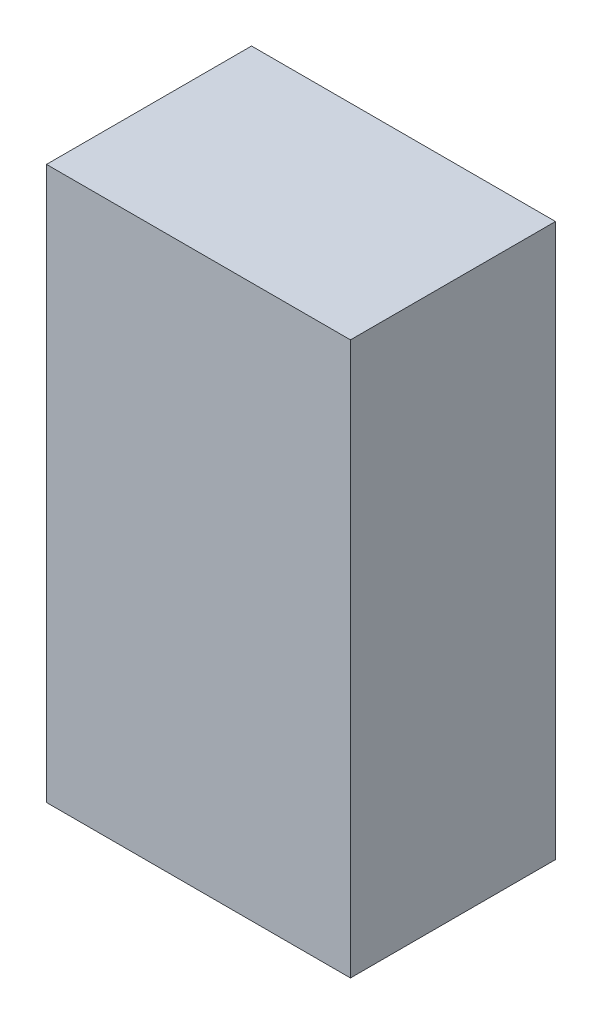
ISO-10303-21;
HEADER;
FILE_DESCRIPTION(('STEP AP214'),'2;1');
FILE_NAME('part.step','',(''),(''),'','','');
FILE_SCHEMA(('AUTOMOTIVE_DESIGN { 1 0 10303 214 1 1 1 1 }'));
ENDSEC;
DATA;
#1=APPLICATION_CONTEXT('core data for automotive mechanical design processes');
#2=APPLICATION_PROTOCOL_DEFINITION('international standard','automotive_design',2000,#1);
#3=PRODUCT_CONTEXT('',#1,'mechanical');
#4=PRODUCT('Part','Part','',(#3));
#5=PRODUCT_RELATED_PRODUCT_CATEGORY('part','',(#4));
#6=PRODUCT_DEFINITION_FORMATION('','',#4);
#7=PRODUCT_DEFINITION_CONTEXT('part definition',#1,'design');
#8=PRODUCT_DEFINITION('design','',#6,#7);
#9=PRODUCT_DEFINITION_SHAPE('','',#8);
#10=(LENGTH_UNIT() NAMED_UNIT(*) SI_UNIT(.MILLI.,.METRE.));
#11=(NAMED_UNIT(*) PLANE_ANGLE_UNIT() SI_UNIT($,.RADIAN.));
#12=(NAMED_UNIT(*) SI_UNIT($,.STERADIAN.) SOLID_ANGLE_UNIT());
#13=UNCERTAINTY_MEASURE_WITH_UNIT(LENGTH_MEASURE(1.E-05),#10,'distance_accuracy_value','');
#14=(GEOMETRIC_REPRESENTATION_CONTEXT(3) GLOBAL_UNCERTAINTY_ASSIGNED_CONTEXT((#13)) GLOBAL_UNIT_ASSIGNED_CONTEXT((#10,
#11,#12)) REPRESENTATION_CONTEXT('',''));
#15=CARTESIAN_POINT('',(0.,0.,0.));
#16=DIRECTION('',(0.,0.,1.));
#17=DIRECTION('',(1.,0.,0.));
#18=AXIS2_PLACEMENT_3D('',#15,#16,#17);
#19=CARTESIAN_POINT('',(14.564178749023,61.063674225234,-1.719322996411));
#20=DIRECTION('',(0.,0.,1.));
#21=DIRECTION('',(1.,0.,0.));
#22=AXIS2_PLACEMENT_3D('',#19,#20,#21);
#23=PLANE('',#22);
#24=DIRECTION('',(0.,-1.,0.));
#25=VECTOR('',#24,1.);
#26=CARTESIAN_POINT('',(14.564178749023,71.063674545234,-1.719322996411));
#27=LINE('',#26,#25);
#28=CARTESIAN_POINT('',(14.564178749023,71.063674545234,-1.719322996411));
#29=VERTEX_POINT('',#28);
#30=CARTESIAN_POINT('',(14.564178749023,61.063674225234,-1.719322996411));
#31=VERTEX_POINT('',#30);
#32=EDGE_CURVE('E26',#29,#31,#27,.T.);
#33=ORIENTED_EDGE('',*,*,#32,.F.);
#34=DIRECTION('',(1.,0.,0.));
#35=VECTOR('',#34,1.);
#36=CARTESIAN_POINT('',(9.064179589023,71.063674545234,-1.719322996411));
#37=LINE('',#36,#35);
#38=CARTESIAN_POINT('',(9.064179589023,71.063674545234,-1.719322996411));
#39=VERTEX_POINT('',#38);
#40=EDGE_CURVE('E76',#39,#29,#37,.T.);
#41=ORIENTED_EDGE('',*,*,#40,.F.);
#42=DIRECTION('',(0.,1.,0.));
#43=VECTOR('',#42,1.);
#44=CARTESIAN_POINT('',(9.064179589023,61.063674225234,-1.719322996411));
#45=LINE('',#44,#43);
#46=CARTESIAN_POINT('',(9.064179589023,61.063674225234,-1.719322996411));
#47=VERTEX_POINT('',#46);
#48=EDGE_CURVE('E96',#47,#39,#45,.T.);
#49=ORIENTED_EDGE('',*,*,#48,.F.);
#50=DIRECTION('',(-1.,0.,0.));
#51=VECTOR('',#50,1.);
#52=CARTESIAN_POINT('',(14.564178749023,61.063674225234,-1.719322996411));
#53=LINE('',#52,#51);
#54=EDGE_CURVE('E112',#31,#47,#53,.T.);
#55=ORIENTED_EDGE('',*,*,#54,.F.);
#56=EDGE_LOOP('',(#33,#41,#49,#55));
#57=FACE_BOUND('',#56,.T.);
#58=ADVANCED_FACE('F16',(#57),#23,.T.);
#59=CARTESIAN_POINT('',(14.564178749023,61.063674225234,-5.429323196411));
#60=DIRECTION('',(0.,0.,1.));
#61=DIRECTION('',(1.,0.,0.));
#62=AXIS2_PLACEMENT_3D('',#59,#60,#61);
#63=PLANE('',#62);
#64=DIRECTION('',(-1.,0.,0.));
#65=VECTOR('',#64,1.);
#66=CARTESIAN_POINT('',(14.564178749023,61.063674225234,-5.429323196411));
#67=LINE('',#66,#65);
#68=CARTESIAN_POINT('',(14.564178749023,61.063674225234,-5.429323196411));
#69=VERTEX_POINT('',#68);
#70=CARTESIAN_POINT('',(9.064179589023,61.063674225234,-5.429323196411));
#71=VERTEX_POINT('',#70);
#72=EDGE_CURVE('E91',#69,#71,#67,.T.);
#73=ORIENTED_EDGE('',*,*,#72,.T.);
#74=DIRECTION('',(0.,1.,0.));
#75=VECTOR('',#74,1.);
#76=CARTESIAN_POINT('',(9.064179589023,61.063674225234,-5.429323196411));
#77=LINE('',#76,#75);
#78=CARTESIAN_POINT('',(9.064179589023,71.063674545234,-5.429323196411));
#79=VERTEX_POINT('',#78);
#80=EDGE_CURVE('E71',#71,#79,#77,.T.);
#81=ORIENTED_EDGE('',*,*,#80,.T.);
#82=DIRECTION('',(1.,0.,0.));
#83=VECTOR('',#82,1.);
#84=CARTESIAN_POINT('',(9.064179589023,71.063674545234,-5.429323196411));
#85=LINE('',#84,#83);
#86=CARTESIAN_POINT('',(14.564178749023,71.063674545234,-5.429323196411));
#87=VERTEX_POINT('',#86);
#88=EDGE_CURVE('E83',#79,#87,#85,.T.);
#89=ORIENTED_EDGE('',*,*,#88,.T.);
#90=DIRECTION('',(0.,-1.,0.));
#91=VECTOR('',#90,1.);
#92=CARTESIAN_POINT('',(14.564178749023,71.063674545234,-5.429323196411));
#93=LINE('',#92,#91);
#94=EDGE_CURVE('E11',#87,#69,#93,.T.);
#95=ORIENTED_EDGE('',*,*,#94,.T.);
#96=EDGE_LOOP('',(#73,#81,#89,#95));
#97=FACE_BOUND('',#96,.T.);
#98=ADVANCED_FACE('F90',(#97),#63,.F.);
#99=CARTESIAN_POINT('',(14.564178749023,71.063674545234,-5.429323196411));
#100=DIRECTION('',(1.,0.,0.));
#101=DIRECTION('',(0.,1.,0.));
#102=AXIS2_PLACEMENT_3D('',#99,#100,#101);
#103=PLANE('',#102);
#104=DIRECTION('',(0.,0.,1.));
#105=VECTOR('',#104,1.);
#106=CARTESIAN_POINT('',(14.564178749023,71.063674545234,-5.429323196411));
#107=LINE('',#106,#105);
#108=EDGE_CURVE('E87',#87,#29,#107,.T.);
#109=ORIENTED_EDGE('',*,*,#108,.T.);
#110=ORIENTED_EDGE('',*,*,#32,.T.);
#111=DIRECTION('',(0.,0.,1.));
#112=VECTOR('',#111,1.);
#113=CARTESIAN_POINT('',(14.564178749023,61.063674225234,-5.429323196411));
#114=LINE('',#113,#112);
#115=EDGE_CURVE('E108',#69,#31,#114,.T.);
#116=ORIENTED_EDGE('',*,*,#115,.F.);
#117=ORIENTED_EDGE('',*,*,#94,.F.);
#118=EDGE_LOOP('',(#109,#110,#116,#117));
#119=FACE_BOUND('',#118,.T.);
#120=ADVANCED_FACE('F126',(#119),#103,.T.);
#121=CARTESIAN_POINT('',(9.064179589023,71.063674545234,-5.429323196411));
#122=DIRECTION('',(0.,1.,0.));
#123=DIRECTION('',(1.,0.,0.));
#124=AXIS2_PLACEMENT_3D('',#121,#122,#123);
#125=PLANE('',#124);
#126=DIRECTION('',(0.,0.,1.));
#127=VECTOR('',#126,1.);
#128=CARTESIAN_POINT('',(9.064179589023,71.063674545234,-5.429323196411));
#129=LINE('',#128,#127);
#130=EDGE_CURVE('E85',#79,#39,#129,.T.);
#131=ORIENTED_EDGE('',*,*,#130,.T.);
#132=ORIENTED_EDGE('',*,*,#40,.T.);
#133=ORIENTED_EDGE('',*,*,#108,.F.);
#134=ORIENTED_EDGE('',*,*,#88,.F.);
#135=EDGE_LOOP('',(#131,#132,#133,#134));
#136=FACE_BOUND('',#135,.T.);
#137=ADVANCED_FACE('F84',(#136),#125,.T.);
#138=CARTESIAN_POINT('',(9.064179589023,61.063674225234,-5.429323196411));
#139=DIRECTION('',(-1.,0.,0.));
#140=DIRECTION('',(0.,0.,1.));
#141=AXIS2_PLACEMENT_3D('',#138,#139,#140);
#142=PLANE('',#141);
#143=DIRECTION('',(0.,0.,1.));
#144=VECTOR('',#143,1.);
#145=CARTESIAN_POINT('',(9.064179589023,61.063674225234,-5.429323196411));
#146=LINE('',#145,#144);
#147=EDGE_CURVE('E19',#71,#47,#146,.T.);
#148=ORIENTED_EDGE('',*,*,#147,.T.);
#149=ORIENTED_EDGE('',*,*,#48,.T.);
#150=ORIENTED_EDGE('',*,*,#130,.F.);
#151=ORIENTED_EDGE('',*,*,#80,.F.);
#152=EDGE_LOOP('',(#148,#149,#150,#151));
#153=FACE_BOUND('',#152,.T.);
#154=ADVANCED_FACE('F95',(#153),#142,.T.);
#155=CARTESIAN_POINT('',(14.564178749023,61.063674225234,-5.429323196411));
#156=DIRECTION('',(0.,-1.,0.));
#157=DIRECTION('',(0.,0.,-1.));
#158=AXIS2_PLACEMENT_3D('',#155,#156,#157);
#159=PLANE('',#158);
#160=ORIENTED_EDGE('',*,*,#115,.T.);
#161=ORIENTED_EDGE('',*,*,#54,.T.);
#162=ORIENTED_EDGE('',*,*,#147,.F.);
#163=ORIENTED_EDGE('',*,*,#72,.F.);
#164=EDGE_LOOP('',(#160,#161,#162,#163));
#165=FACE_BOUND('',#164,.T.);
#166=ADVANCED_FACE('F125',(#165),#159,.T.);
#167=CLOSED_SHELL('',(#58,#98,#120,#137,#154,#166));
#168=MANIFOLD_SOLID_BREP('B1',#167);
#169=ADVANCED_BREP_SHAPE_REPRESENTATION('',(#18,#168),#14);
#170=SHAPE_DEFINITION_REPRESENTATION(#9,#169);
ENDSEC;
END-ISO-10303-21;
